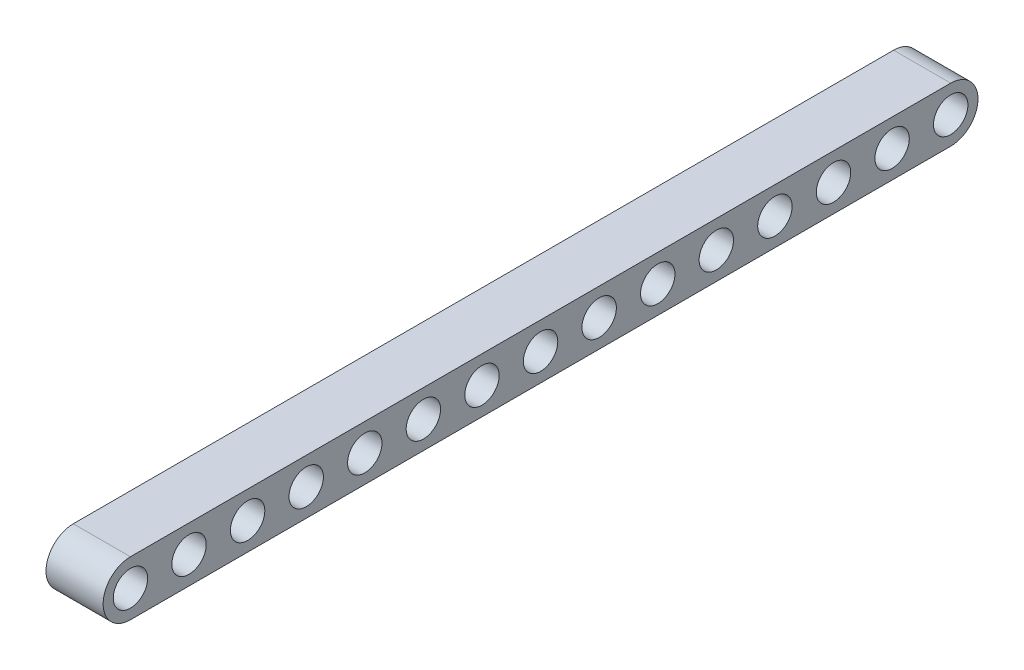
ISO-10303-21;
HEADER;
FILE_DESCRIPTION(('STEP AP214'),'2;1');
FILE_NAME('part.step','',(''),(''),'','','');
FILE_SCHEMA(('AUTOMOTIVE_DESIGN { 1 0 10303 214 1 1 1 1 }'));
ENDSEC;
DATA;
#1=APPLICATION_CONTEXT('core data for automotive mechanical design processes');
#2=APPLICATION_PROTOCOL_DEFINITION('international standard','automotive_design',2000,#1);
#3=PRODUCT_CONTEXT('',#1,'mechanical');
#4=PRODUCT('Part','Part','',(#3));
#5=PRODUCT_RELATED_PRODUCT_CATEGORY('part','',(#4));
#6=PRODUCT_DEFINITION_FORMATION('','',#4);
#7=PRODUCT_DEFINITION_CONTEXT('part definition',#1,'design');
#8=PRODUCT_DEFINITION('design','',#6,#7);
#9=PRODUCT_DEFINITION_SHAPE('','',#8);
#10=(LENGTH_UNIT() NAMED_UNIT(*) SI_UNIT(.MILLI.,.METRE.));
#11=(NAMED_UNIT(*) PLANE_ANGLE_UNIT() SI_UNIT($,.RADIAN.));
#12=(NAMED_UNIT(*) SI_UNIT($,.STERADIAN.) SOLID_ANGLE_UNIT());
#13=UNCERTAINTY_MEASURE_WITH_UNIT(LENGTH_MEASURE(1.E-05),#10,'distance_accuracy_value','');
#14=(GEOMETRIC_REPRESENTATION_CONTEXT(3) GLOBAL_UNCERTAINTY_ASSIGNED_CONTEXT((#13)) GLOBAL_UNIT_ASSIGNED_CONTEXT((#10,
#11,#12)) REPRESENTATION_CONTEXT('',''));
#15=CARTESIAN_POINT('',(0.,0.,0.));
#16=DIRECTION('',(0.,0.,1.));
#17=DIRECTION('',(1.,0.,0.));
#18=AXIS2_PLACEMENT_3D('',#15,#16,#17);
#19=CARTESIAN_POINT('',(7.8,0.,-56.));
#20=DIRECTION('',(1.,0.,0.));
#21=DIRECTION('',(0.,0.,-1.));
#22=AXIS2_PLACEMENT_3D('',#19,#20,#21);
#23=PLANE('',#22);
#24=CARTESIAN_POINT('',(7.8,0.,-48.));
#25=DIRECTION('',(1.,0.,0.));
#26=DIRECTION('',(0.,0.,-1.));
#27=AXIS2_PLACEMENT_3D('',#24,#25,#26);
#28=CIRCLE('',#27,2.35);
#29=CARTESIAN_POINT('',(7.8,0.,-50.35));
#30=VERTEX_POINT('',#29);
#31=EDGE_CURVE('E186',#30,#30,#28,.T.);
#32=ORIENTED_EDGE('',*,*,#31,.F.);
#33=EDGE_LOOP('',(#32));
#34=FACE_BOUND('',#33,.T.);
#35=CARTESIAN_POINT('',(7.8,0.,-32.));
#36=DIRECTION('',(1.,0.,0.));
#37=DIRECTION('',(0.,0.,-1.));
#38=AXIS2_PLACEMENT_3D('',#35,#36,#37);
#39=CIRCLE('',#38,2.35);
#40=CARTESIAN_POINT('',(7.8,0.,-34.35));
#41=VERTEX_POINT('',#40);
#42=EDGE_CURVE('E174',#41,#41,#39,.T.);
#43=ORIENTED_EDGE('',*,*,#42,.F.);
#44=EDGE_LOOP('',(#43));
#45=FACE_BOUND('',#44,.T.);
#46=CARTESIAN_POINT('',(7.8,0.,-16.));
#47=DIRECTION('',(1.,0.,0.));
#48=DIRECTION('',(0.,0.,-1.));
#49=AXIS2_PLACEMENT_3D('',#46,#47,#48);
#50=CIRCLE('',#49,2.35);
#51=CARTESIAN_POINT('',(7.8,0.,-18.35));
#52=VERTEX_POINT('',#51);
#53=EDGE_CURVE('E162',#52,#52,#50,.T.);
#54=ORIENTED_EDGE('',*,*,#53,.F.);
#55=EDGE_LOOP('',(#54));
#56=FACE_BOUND('',#55,.T.);
#57=CARTESIAN_POINT('',(7.8,0.,0.));
#58=DIRECTION('',(1.,0.,0.));
#59=DIRECTION('',(0.,0.,-1.));
#60=AXIS2_PLACEMENT_3D('',#57,#58,#59);
#61=CIRCLE('',#60,2.35);
#62=CARTESIAN_POINT('',(7.8,0.,-2.34999999999999));
#63=VERTEX_POINT('',#62);
#64=EDGE_CURVE('E150',#63,#63,#61,.T.);
#65=ORIENTED_EDGE('',*,*,#64,.F.);
#66=EDGE_LOOP('',(#65));
#67=FACE_BOUND('',#66,.T.);
#68=CARTESIAN_POINT('',(7.8,0.,16.));
#69=DIRECTION('',(1.,0.,0.));
#70=DIRECTION('',(0.,0.,-1.));
#71=AXIS2_PLACEMENT_3D('',#68,#69,#70);
#72=CIRCLE('',#71,2.35);
#73=CARTESIAN_POINT('',(7.8,0.,13.65));
#74=VERTEX_POINT('',#73);
#75=EDGE_CURVE('E138',#74,#74,#72,.T.);
#76=ORIENTED_EDGE('',*,*,#75,.F.);
#77=EDGE_LOOP('',(#76));
#78=FACE_BOUND('',#77,.T.);
#79=CARTESIAN_POINT('',(7.8,0.,32.));
#80=DIRECTION('',(1.,0.,0.));
#81=DIRECTION('',(0.,0.,-1.));
#82=AXIS2_PLACEMENT_3D('',#79,#80,#81);
#83=CIRCLE('',#82,2.35);
#84=CARTESIAN_POINT('',(7.8,0.,29.65));
#85=VERTEX_POINT('',#84);
#86=EDGE_CURVE('E126',#85,#85,#83,.T.);
#87=ORIENTED_EDGE('',*,*,#86,.F.);
#88=EDGE_LOOP('',(#87));
#89=FACE_BOUND('',#88,.T.);
#90=CARTESIAN_POINT('',(7.8,0.,48.));
#91=DIRECTION('',(1.,0.,0.));
#92=DIRECTION('',(0.,0.,-1.));
#93=AXIS2_PLACEMENT_3D('',#90,#91,#92);
#94=CIRCLE('',#93,2.35);
#95=CARTESIAN_POINT('',(7.8,0.,45.65));
#96=VERTEX_POINT('',#95);
#97=EDGE_CURVE('E114',#96,#96,#94,.T.);
#98=ORIENTED_EDGE('',*,*,#97,.F.);
#99=EDGE_LOOP('',(#98));
#100=FACE_BOUND('',#99,.T.);
#101=CARTESIAN_POINT('',(7.8,0.,-56.));
#102=DIRECTION('',(1.,0.,0.));
#103=DIRECTION('',(0.,0.,-1.));
#104=AXIS2_PLACEMENT_3D('',#101,#102,#103);
#105=CIRCLE('',#104,3.73000000000003);
#106=CARTESIAN_POINT('',(7.8,-3.73000000000003,-56.));
#107=VERTEX_POINT('',#106);
#108=CARTESIAN_POINT('',(7.8,3.73000000000003,-56.));
#109=VERTEX_POINT('',#108);
#110=EDGE_CURVE('E84',#107,#109,#105,.T.);
#111=ORIENTED_EDGE('',*,*,#110,.T.);
#112=DIRECTION('',(0.,0.,1.));
#113=VECTOR('',#112,1.);
#114=CARTESIAN_POINT('',(7.8,3.73000000000003,56.));
#115=LINE('',#114,#113);
#116=CARTESIAN_POINT('',(7.8,3.73,56.));
#117=VERTEX_POINT('',#116);
#118=EDGE_CURVE('E79',#109,#117,#115,.T.);
#119=ORIENTED_EDGE('',*,*,#118,.T.);
#120=CARTESIAN_POINT('',(7.8,0.,56.));
#121=DIRECTION('',(1.,0.,0.));
#122=DIRECTION('',(0.,0.,-1.));
#123=AXIS2_PLACEMENT_3D('',#120,#121,#122);
#124=CIRCLE('',#123,3.73);
#125=CARTESIAN_POINT('',(7.8,-3.72999999999997,56.));
#126=VERTEX_POINT('',#125);
#127=EDGE_CURVE('E82',#117,#126,#124,.T.);
#128=ORIENTED_EDGE('',*,*,#127,.T.);
#129=DIRECTION('',(0.,0.,-1.));
#130=VECTOR('',#129,1.);
#131=CARTESIAN_POINT('',(7.8,-3.72999999999997,56.));
#132=LINE('',#131,#130);
#133=EDGE_CURVE('E49',#126,#107,#132,.T.);
#134=ORIENTED_EDGE('',*,*,#133,.T.);
#135=EDGE_LOOP('',(#111,#119,#128,#134));
#136=FACE_BOUND('',#135,.T.);
#137=CARTESIAN_POINT('',(7.8,0.,56.));
#138=DIRECTION('',(1.,0.,0.));
#139=DIRECTION('',(0.,0.,-1.));
#140=AXIS2_PLACEMENT_3D('',#137,#138,#139);
#141=CIRCLE('',#140,2.35);
#142=CARTESIAN_POINT('',(7.8,0.,53.65));
#143=VERTEX_POINT('',#142);
#144=EDGE_CURVE('E99',#143,#143,#141,.T.);
#145=ORIENTED_EDGE('',*,*,#144,.F.);
#146=EDGE_LOOP('',(#145));
#147=FACE_BOUND('',#146,.T.);
#148=CARTESIAN_POINT('',(7.8,0.,40.));
#149=DIRECTION('',(1.,0.,0.));
#150=DIRECTION('',(0.,0.,-1.));
#151=AXIS2_PLACEMENT_3D('',#148,#149,#150);
#152=CIRCLE('',#151,2.35);
#153=CARTESIAN_POINT('',(7.8,0.,37.65));
#154=VERTEX_POINT('',#153);
#155=EDGE_CURVE('E120',#154,#154,#152,.T.);
#156=ORIENTED_EDGE('',*,*,#155,.F.);
#157=EDGE_LOOP('',(#156));
#158=FACE_BOUND('',#157,.T.);
#159=CARTESIAN_POINT('',(7.8,0.,24.));
#160=DIRECTION('',(1.,0.,0.));
#161=DIRECTION('',(0.,0.,-1.));
#162=AXIS2_PLACEMENT_3D('',#159,#160,#161);
#163=CIRCLE('',#162,2.35);
#164=CARTESIAN_POINT('',(7.8,0.,21.65));
#165=VERTEX_POINT('',#164);
#166=EDGE_CURVE('E132',#165,#165,#163,.T.);
#167=ORIENTED_EDGE('',*,*,#166,.F.);
#168=EDGE_LOOP('',(#167));
#169=FACE_BOUND('',#168,.T.);
#170=CARTESIAN_POINT('',(7.8,0.,8.00000000000001));
#171=DIRECTION('',(1.,0.,0.));
#172=DIRECTION('',(0.,0.,-1.));
#173=AXIS2_PLACEMENT_3D('',#170,#171,#172);
#174=CIRCLE('',#173,2.35);
#175=CARTESIAN_POINT('',(7.8,0.,5.65000000000001));
#176=VERTEX_POINT('',#175);
#177=EDGE_CURVE('E144',#176,#176,#174,.T.);
#178=ORIENTED_EDGE('',*,*,#177,.F.);
#179=EDGE_LOOP('',(#178));
#180=FACE_BOUND('',#179,.T.);
#181=CARTESIAN_POINT('',(7.8,0.,-7.99999999999999));
#182=DIRECTION('',(1.,0.,0.));
#183=DIRECTION('',(0.,0.,-1.));
#184=AXIS2_PLACEMENT_3D('',#181,#182,#183);
#185=CIRCLE('',#184,2.35);
#186=CARTESIAN_POINT('',(7.8,0.,-10.35));
#187=VERTEX_POINT('',#186);
#188=EDGE_CURVE('E156',#187,#187,#185,.T.);
#189=ORIENTED_EDGE('',*,*,#188,.F.);
#190=EDGE_LOOP('',(#189));
#191=FACE_BOUND('',#190,.T.);
#192=CARTESIAN_POINT('',(7.8,0.,-24.));
#193=DIRECTION('',(1.,0.,0.));
#194=DIRECTION('',(0.,0.,-1.));
#195=AXIS2_PLACEMENT_3D('',#192,#193,#194);
#196=CIRCLE('',#195,2.35);
#197=CARTESIAN_POINT('',(7.8,0.,-26.35));
#198=VERTEX_POINT('',#197);
#199=EDGE_CURVE('E168',#198,#198,#196,.T.);
#200=ORIENTED_EDGE('',*,*,#199,.F.);
#201=EDGE_LOOP('',(#200));
#202=FACE_BOUND('',#201,.T.);
#203=CARTESIAN_POINT('',(7.8,0.,-40.));
#204=DIRECTION('',(1.,0.,0.));
#205=DIRECTION('',(0.,0.,-1.));
#206=AXIS2_PLACEMENT_3D('',#203,#204,#205);
#207=CIRCLE('',#206,2.35);
#208=CARTESIAN_POINT('',(7.8,0.,-42.35));
#209=VERTEX_POINT('',#208);
#210=EDGE_CURVE('E180',#209,#209,#207,.T.);
#211=ORIENTED_EDGE('',*,*,#210,.F.);
#212=EDGE_LOOP('',(#211));
#213=FACE_BOUND('',#212,.T.);
#214=CARTESIAN_POINT('',(7.8,0.,-56.));
#215=DIRECTION('',(1.,0.,0.));
#216=DIRECTION('',(0.,0.,-1.));
#217=AXIS2_PLACEMENT_3D('',#214,#215,#216);
#218=CIRCLE('',#217,2.35);
#219=CARTESIAN_POINT('',(7.8,0.,-58.35));
#220=VERTEX_POINT('',#219);
#221=EDGE_CURVE('E192',#220,#220,#218,.T.);
#222=ORIENTED_EDGE('',*,*,#221,.F.);
#223=EDGE_LOOP('',(#222));
#224=FACE_BOUND('',#223,.T.);
#225=ADVANCED_FACE('F32',(#34,#45,#56,#67,#78,#89,#100,#136,#147,#158,#169,#180,#191,#202,#213,
#224),#23,.T.);
#226=CARTESIAN_POINT('',(0.,0.,-56.));
#227=DIRECTION('',(1.,0.,0.));
#228=DIRECTION('',(0.,0.,-1.));
#229=AXIS2_PLACEMENT_3D('',#226,#227,#228);
#230=PLANE('',#229);
#231=CARTESIAN_POINT('',(0.,0.,-56.));
#232=DIRECTION('',(1.,0.,0.));
#233=DIRECTION('',(0.,0.,-1.));
#234=AXIS2_PLACEMENT_3D('',#231,#232,#233);
#235=CIRCLE('',#234,3.73000000000003);
#236=CARTESIAN_POINT('',(0.,-3.73000000000003,-56.));
#237=VERTEX_POINT('',#236);
#238=CARTESIAN_POINT('',(0.,3.73000000000003,-56.));
#239=VERTEX_POINT('',#238);
#240=EDGE_CURVE('E96',#237,#239,#235,.T.);
#241=ORIENTED_EDGE('',*,*,#240,.F.);
#242=DIRECTION('',(0.,0.,-1.));
#243=VECTOR('',#242,1.);
#244=CARTESIAN_POINT('',(0.,-3.72999999999997,56.));
#245=LINE('',#244,#243);
#246=CARTESIAN_POINT('',(0.,-3.72999999999997,56.));
#247=VERTEX_POINT('',#246);
#248=EDGE_CURVE('E72',#247,#237,#245,.T.);
#249=ORIENTED_EDGE('',*,*,#248,.F.);
#250=CARTESIAN_POINT('',(0.,0.,56.));
#251=DIRECTION('',(1.,0.,0.));
#252=DIRECTION('',(0.,0.,-1.));
#253=AXIS2_PLACEMENT_3D('',#250,#251,#252);
#254=CIRCLE('',#253,3.73);
#255=CARTESIAN_POINT('',(0.,3.73,56.));
#256=VERTEX_POINT('',#255);
#257=EDGE_CURVE('E66',#256,#247,#254,.T.);
#258=ORIENTED_EDGE('',*,*,#257,.F.);
#259=DIRECTION('',(0.,0.,1.));
#260=VECTOR('',#259,1.);
#261=CARTESIAN_POINT('',(0.,3.73000000000003,56.));
#262=LINE('',#261,#260);
#263=EDGE_CURVE('E88',#239,#256,#262,.T.);
#264=ORIENTED_EDGE('',*,*,#263,.F.);
#265=EDGE_LOOP('',(#241,#249,#258,#264));
#266=FACE_BOUND('',#265,.T.);
#267=CARTESIAN_POINT('',(0.,0.,56.));
#268=DIRECTION('',(1.,0.,0.));
#269=DIRECTION('',(0.,0.,-1.));
#270=AXIS2_PLACEMENT_3D('',#267,#268,#269);
#271=CIRCLE('',#270,2.35);
#272=CARTESIAN_POINT('',(0.,0.,53.65));
#273=VERTEX_POINT('',#272);
#274=EDGE_CURVE('E111',#273,#273,#271,.T.);
#275=ORIENTED_EDGE('',*,*,#274,.T.);
#276=EDGE_LOOP('',(#275));
#277=FACE_BOUND('',#276,.T.);
#278=CARTESIAN_POINT('',(0.,0.,48.));
#279=DIRECTION('',(1.,0.,0.));
#280=DIRECTION('',(0.,0.,-1.));
#281=AXIS2_PLACEMENT_3D('',#278,#279,#280);
#282=CIRCLE('',#281,2.35);
#283=CARTESIAN_POINT('',(0.,0.,45.65));
#284=VERTEX_POINT('',#283);
#285=EDGE_CURVE('E117',#284,#284,#282,.T.);
#286=ORIENTED_EDGE('',*,*,#285,.T.);
#287=EDGE_LOOP('',(#286));
#288=FACE_BOUND('',#287,.T.);
#289=CARTESIAN_POINT('',(0.,0.,40.));
#290=DIRECTION('',(1.,0.,0.));
#291=DIRECTION('',(0.,0.,-1.));
#292=AXIS2_PLACEMENT_3D('',#289,#290,#291);
#293=CIRCLE('',#292,2.35);
#294=CARTESIAN_POINT('',(0.,0.,37.65));
#295=VERTEX_POINT('',#294);
#296=EDGE_CURVE('E123',#295,#295,#293,.T.);
#297=ORIENTED_EDGE('',*,*,#296,.T.);
#298=EDGE_LOOP('',(#297));
#299=FACE_BOUND('',#298,.T.);
#300=CARTESIAN_POINT('',(0.,0.,32.));
#301=DIRECTION('',(1.,0.,0.));
#302=DIRECTION('',(0.,0.,-1.));
#303=AXIS2_PLACEMENT_3D('',#300,#301,#302);
#304=CIRCLE('',#303,2.35);
#305=CARTESIAN_POINT('',(0.,0.,29.65));
#306=VERTEX_POINT('',#305);
#307=EDGE_CURVE('E129',#306,#306,#304,.T.);
#308=ORIENTED_EDGE('',*,*,#307,.T.);
#309=EDGE_LOOP('',(#308));
#310=FACE_BOUND('',#309,.T.);
#311=CARTESIAN_POINT('',(0.,0.,24.));
#312=DIRECTION('',(1.,0.,0.));
#313=DIRECTION('',(0.,0.,-1.));
#314=AXIS2_PLACEMENT_3D('',#311,#312,#313);
#315=CIRCLE('',#314,2.35);
#316=CARTESIAN_POINT('',(0.,0.,21.65));
#317=VERTEX_POINT('',#316);
#318=EDGE_CURVE('E135',#317,#317,#315,.T.);
#319=ORIENTED_EDGE('',*,*,#318,.T.);
#320=EDGE_LOOP('',(#319));
#321=FACE_BOUND('',#320,.T.);
#322=CARTESIAN_POINT('',(0.,0.,16.));
#323=DIRECTION('',(1.,0.,0.));
#324=DIRECTION('',(0.,0.,-1.));
#325=AXIS2_PLACEMENT_3D('',#322,#323,#324);
#326=CIRCLE('',#325,2.35);
#327=CARTESIAN_POINT('',(0.,0.,13.65));
#328=VERTEX_POINT('',#327);
#329=EDGE_CURVE('E141',#328,#328,#326,.T.);
#330=ORIENTED_EDGE('',*,*,#329,.T.);
#331=EDGE_LOOP('',(#330));
#332=FACE_BOUND('',#331,.T.);
#333=CARTESIAN_POINT('',(0.,0.,8.00000000000001));
#334=DIRECTION('',(1.,0.,0.));
#335=DIRECTION('',(0.,0.,-1.));
#336=AXIS2_PLACEMENT_3D('',#333,#334,#335);
#337=CIRCLE('',#336,2.35);
#338=CARTESIAN_POINT('',(0.,0.,5.65000000000001));
#339=VERTEX_POINT('',#338);
#340=EDGE_CURVE('E147',#339,#339,#337,.T.);
#341=ORIENTED_EDGE('',*,*,#340,.T.);
#342=EDGE_LOOP('',(#341));
#343=FACE_BOUND('',#342,.T.);
#344=CARTESIAN_POINT('',(0.,0.,0.));
#345=DIRECTION('',(1.,0.,0.));
#346=DIRECTION('',(0.,0.,-1.));
#347=AXIS2_PLACEMENT_3D('',#344,#345,#346);
#348=CIRCLE('',#347,2.35);
#349=CARTESIAN_POINT('',(0.,0.,-2.34999999999999));
#350=VERTEX_POINT('',#349);
#351=EDGE_CURVE('E153',#350,#350,#348,.T.);
#352=ORIENTED_EDGE('',*,*,#351,.T.);
#353=EDGE_LOOP('',(#352));
#354=FACE_BOUND('',#353,.T.);
#355=CARTESIAN_POINT('',(0.,0.,-7.99999999999999));
#356=DIRECTION('',(1.,0.,0.));
#357=DIRECTION('',(0.,0.,-1.));
#358=AXIS2_PLACEMENT_3D('',#355,#356,#357);
#359=CIRCLE('',#358,2.35);
#360=CARTESIAN_POINT('',(0.,0.,-10.35));
#361=VERTEX_POINT('',#360);
#362=EDGE_CURVE('E159',#361,#361,#359,.T.);
#363=ORIENTED_EDGE('',*,*,#362,.T.);
#364=EDGE_LOOP('',(#363));
#365=FACE_BOUND('',#364,.T.);
#366=CARTESIAN_POINT('',(0.,0.,-16.));
#367=DIRECTION('',(1.,0.,0.));
#368=DIRECTION('',(0.,0.,-1.));
#369=AXIS2_PLACEMENT_3D('',#366,#367,#368);
#370=CIRCLE('',#369,2.35);
#371=CARTESIAN_POINT('',(0.,0.,-18.35));
#372=VERTEX_POINT('',#371);
#373=EDGE_CURVE('E165',#372,#372,#370,.T.);
#374=ORIENTED_EDGE('',*,*,#373,.T.);
#375=EDGE_LOOP('',(#374));
#376=FACE_BOUND('',#375,.T.);
#377=CARTESIAN_POINT('',(0.,0.,-24.));
#378=DIRECTION('',(1.,0.,0.));
#379=DIRECTION('',(0.,0.,-1.));
#380=AXIS2_PLACEMENT_3D('',#377,#378,#379);
#381=CIRCLE('',#380,2.35);
#382=CARTESIAN_POINT('',(0.,0.,-26.35));
#383=VERTEX_POINT('',#382);
#384=EDGE_CURVE('E171',#383,#383,#381,.T.);
#385=ORIENTED_EDGE('',*,*,#384,.T.);
#386=EDGE_LOOP('',(#385));
#387=FACE_BOUND('',#386,.T.);
#388=CARTESIAN_POINT('',(0.,0.,-32.));
#389=DIRECTION('',(1.,0.,0.));
#390=DIRECTION('',(0.,0.,-1.));
#391=AXIS2_PLACEMENT_3D('',#388,#389,#390);
#392=CIRCLE('',#391,2.35);
#393=CARTESIAN_POINT('',(0.,0.,-34.35));
#394=VERTEX_POINT('',#393);
#395=EDGE_CURVE('E177',#394,#394,#392,.T.);
#396=ORIENTED_EDGE('',*,*,#395,.T.);
#397=EDGE_LOOP('',(#396));
#398=FACE_BOUND('',#397,.T.);
#399=CARTESIAN_POINT('',(0.,0.,-40.));
#400=DIRECTION('',(1.,0.,0.));
#401=DIRECTION('',(0.,0.,-1.));
#402=AXIS2_PLACEMENT_3D('',#399,#400,#401);
#403=CIRCLE('',#402,2.35);
#404=CARTESIAN_POINT('',(0.,0.,-42.35));
#405=VERTEX_POINT('',#404);
#406=EDGE_CURVE('E183',#405,#405,#403,.T.);
#407=ORIENTED_EDGE('',*,*,#406,.T.);
#408=EDGE_LOOP('',(#407));
#409=FACE_BOUND('',#408,.T.);
#410=CARTESIAN_POINT('',(0.,0.,-48.));
#411=DIRECTION('',(1.,0.,0.));
#412=DIRECTION('',(0.,0.,-1.));
#413=AXIS2_PLACEMENT_3D('',#410,#411,#412);
#414=CIRCLE('',#413,2.35);
#415=CARTESIAN_POINT('',(0.,0.,-50.35));
#416=VERTEX_POINT('',#415);
#417=EDGE_CURVE('E189',#416,#416,#414,.T.);
#418=ORIENTED_EDGE('',*,*,#417,.T.);
#419=EDGE_LOOP('',(#418));
#420=FACE_BOUND('',#419,.T.);
#421=CARTESIAN_POINT('',(0.,0.,-56.));
#422=DIRECTION('',(1.,0.,0.));
#423=DIRECTION('',(0.,0.,-1.));
#424=AXIS2_PLACEMENT_3D('',#421,#422,#423);
#425=CIRCLE('',#424,2.35);
#426=CARTESIAN_POINT('',(0.,0.,-58.35));
#427=VERTEX_POINT('',#426);
#428=EDGE_CURVE('E195',#427,#427,#425,.T.);
#429=ORIENTED_EDGE('',*,*,#428,.T.);
#430=EDGE_LOOP('',(#429));
#431=FACE_BOUND('',#430,.T.);
#432=ADVANCED_FACE('F107',(#266,#277,#288,#299,#310,#321,#332,#343,#354,#365,#376,#387,#398,
#409,#420,#431),#230,.F.);
#433=CARTESIAN_POINT('',(7.8,0.,-56.));
#434=DIRECTION('',(-1.,0.,0.));
#435=DIRECTION('',(0.,0.,1.));
#436=AXIS2_PLACEMENT_3D('',#433,#434,#435);
#437=CYLINDRICAL_SURFACE('',#436,3.73000000000003);
#438=ORIENTED_EDGE('',*,*,#240,.T.);
#439=DIRECTION('',(-1.,0.,0.));
#440=VECTOR('',#439,1.);
#441=CARTESIAN_POINT('',(7.8,3.73000000000003,-56.));
#442=LINE('',#441,#440);
#443=EDGE_CURVE('E11',#109,#239,#442,.T.);
#444=ORIENTED_EDGE('',*,*,#443,.F.);
#445=ORIENTED_EDGE('',*,*,#110,.F.);
#446=DIRECTION('',(-1.,0.,0.));
#447=VECTOR('',#446,1.);
#448=CARTESIAN_POINT('',(7.8,-3.73000000000003,-56.));
#449=LINE('',#448,#447);
#450=EDGE_CURVE('E92',#107,#237,#449,.T.);
#451=ORIENTED_EDGE('',*,*,#450,.T.);
#452=EDGE_LOOP('',(#438,#444,#445,#451));
#453=FACE_BOUND('',#452,.T.);
#454=ADVANCED_FACE('F34',(#453),#437,.T.);
#455=CARTESIAN_POINT('',(7.8,3.73000000000003,56.));
#456=DIRECTION('',(0.,-1.,0.));
#457=DIRECTION('',(0.,0.,-1.));
#458=AXIS2_PLACEMENT_3D('',#455,#456,#457);
#459=PLANE('',#458);
#460=ORIENTED_EDGE('',*,*,#263,.T.);
#461=DIRECTION('',(-1.,0.,0.));
#462=VECTOR('',#461,1.);
#463=CARTESIAN_POINT('',(7.8,3.73,56.));
#464=LINE('',#463,#462);
#465=EDGE_CURVE('E41',#117,#256,#464,.T.);
#466=ORIENTED_EDGE('',*,*,#465,.F.);
#467=ORIENTED_EDGE('',*,*,#118,.F.);
#468=ORIENTED_EDGE('',*,*,#443,.T.);
#469=EDGE_LOOP('',(#460,#466,#467,#468));
#470=FACE_BOUND('',#469,.T.);
#471=ADVANCED_FACE('F87',(#470),#459,.F.);
#472=CARTESIAN_POINT('',(7.8,0.,56.));
#473=DIRECTION('',(-1.,0.,0.));
#474=DIRECTION('',(0.,0.,1.));
#475=AXIS2_PLACEMENT_3D('',#472,#473,#474);
#476=CYLINDRICAL_SURFACE('',#475,3.73);
#477=ORIENTED_EDGE('',*,*,#257,.T.);
#478=DIRECTION('',(-1.,0.,0.));
#479=VECTOR('',#478,1.);
#480=CARTESIAN_POINT('',(7.8,-3.72999999999997,56.));
#481=LINE('',#480,#479);
#482=EDGE_CURVE('E89',#126,#247,#481,.T.);
#483=ORIENTED_EDGE('',*,*,#482,.F.);
#484=ORIENTED_EDGE('',*,*,#127,.F.);
#485=ORIENTED_EDGE('',*,*,#465,.T.);
#486=EDGE_LOOP('',(#477,#483,#484,#485));
#487=FACE_BOUND('',#486,.T.);
#488=ADVANCED_FACE('F90',(#487),#476,.T.);
#489=CARTESIAN_POINT('',(7.8,-3.72999999999997,56.));
#490=DIRECTION('',(0.,1.,0.));
#491=DIRECTION('',(0.,0.,1.));
#492=AXIS2_PLACEMENT_3D('',#489,#490,#491);
#493=PLANE('',#492);
#494=ORIENTED_EDGE('',*,*,#248,.T.);
#495=ORIENTED_EDGE('',*,*,#450,.F.);
#496=ORIENTED_EDGE('',*,*,#133,.F.);
#497=ORIENTED_EDGE('',*,*,#482,.T.);
#498=EDGE_LOOP('',(#494,#495,#496,#497));
#499=FACE_BOUND('',#498,.T.);
#500=ADVANCED_FACE('F104',(#499),#493,.F.);
#501=CARTESIAN_POINT('',(7.8,0.,56.));
#502=DIRECTION('',(-1.,0.,0.));
#503=DIRECTION('',(0.,0.,1.));
#504=AXIS2_PLACEMENT_3D('',#501,#502,#503);
#505=CYLINDRICAL_SURFACE('',#504,2.35);
#506=ORIENTED_EDGE('',*,*,#144,.T.);
#507=EDGE_LOOP('',(#506));
#508=FACE_BOUND('',#507,.T.);
#509=ORIENTED_EDGE('',*,*,#274,.F.);
#510=EDGE_LOOP('',(#509));
#511=FACE_BOUND('',#510,.T.);
#512=ADVANCED_FACE('F214',(#508,#511),#505,.F.);
#513=CARTESIAN_POINT('',(7.8,0.,48.));
#514=DIRECTION('',(-1.,0.,0.));
#515=DIRECTION('',(0.,0.,1.));
#516=AXIS2_PLACEMENT_3D('',#513,#514,#515);
#517=CYLINDRICAL_SURFACE('',#516,2.35);
#518=ORIENTED_EDGE('',*,*,#97,.T.);
#519=EDGE_LOOP('',(#518));
#520=FACE_BOUND('',#519,.T.);
#521=ORIENTED_EDGE('',*,*,#285,.F.);
#522=EDGE_LOOP('',(#521));
#523=FACE_BOUND('',#522,.T.);
#524=ADVANCED_FACE('F260',(#520,#523),#517,.F.);
#525=CARTESIAN_POINT('',(7.8,0.,40.));
#526=DIRECTION('',(-1.,0.,0.));
#527=DIRECTION('',(0.,0.,1.));
#528=AXIS2_PLACEMENT_3D('',#525,#526,#527);
#529=CYLINDRICAL_SURFACE('',#528,2.35);
#530=ORIENTED_EDGE('',*,*,#155,.T.);
#531=EDGE_LOOP('',(#530));
#532=FACE_BOUND('',#531,.T.);
#533=ORIENTED_EDGE('',*,*,#296,.F.);
#534=EDGE_LOOP('',(#533));
#535=FACE_BOUND('',#534,.T.);
#536=ADVANCED_FACE('F268',(#532,#535),#529,.F.);
#537=CARTESIAN_POINT('',(7.8,0.,32.));
#538=DIRECTION('',(-1.,0.,0.));
#539=DIRECTION('',(0.,0.,1.));
#540=AXIS2_PLACEMENT_3D('',#537,#538,#539);
#541=CYLINDRICAL_SURFACE('',#540,2.35);
#542=ORIENTED_EDGE('',*,*,#86,.T.);
#543=EDGE_LOOP('',(#542));
#544=FACE_BOUND('',#543,.T.);
#545=ORIENTED_EDGE('',*,*,#307,.F.);
#546=EDGE_LOOP('',(#545));
#547=FACE_BOUND('',#546,.T.);
#548=ADVANCED_FACE('F276',(#544,#547),#541,.F.);
#549=CARTESIAN_POINT('',(7.8,0.,24.));
#550=DIRECTION('',(-1.,0.,0.));
#551=DIRECTION('',(0.,0.,1.));
#552=AXIS2_PLACEMENT_3D('',#549,#550,#551);
#553=CYLINDRICAL_SURFACE('',#552,2.35);
#554=ORIENTED_EDGE('',*,*,#166,.T.);
#555=EDGE_LOOP('',(#554));
#556=FACE_BOUND('',#555,.T.);
#557=ORIENTED_EDGE('',*,*,#318,.F.);
#558=EDGE_LOOP('',(#557));
#559=FACE_BOUND('',#558,.T.);
#560=ADVANCED_FACE('F285',(#556,#559),#553,.F.);
#561=CARTESIAN_POINT('',(7.8,0.,16.));
#562=DIRECTION('',(-1.,0.,0.));
#563=DIRECTION('',(0.,0.,1.));
#564=AXIS2_PLACEMENT_3D('',#561,#562,#563);
#565=CYLINDRICAL_SURFACE('',#564,2.35);
#566=ORIENTED_EDGE('',*,*,#75,.T.);
#567=EDGE_LOOP('',(#566));
#568=FACE_BOUND('',#567,.T.);
#569=ORIENTED_EDGE('',*,*,#329,.F.);
#570=EDGE_LOOP('',(#569));
#571=FACE_BOUND('',#570,.T.);
#572=ADVANCED_FACE('F294',(#568,#571),#565,.F.);
#573=CARTESIAN_POINT('',(7.8,0.,8.00000000000001));
#574=DIRECTION('',(-1.,0.,0.));
#575=DIRECTION('',(0.,0.,1.));
#576=AXIS2_PLACEMENT_3D('',#573,#574,#575);
#577=CYLINDRICAL_SURFACE('',#576,2.35);
#578=ORIENTED_EDGE('',*,*,#177,.T.);
#579=EDGE_LOOP('',(#578));
#580=FACE_BOUND('',#579,.T.);
#581=ORIENTED_EDGE('',*,*,#340,.F.);
#582=EDGE_LOOP('',(#581));
#583=FACE_BOUND('',#582,.T.);
#584=ADVANCED_FACE('F303',(#580,#583),#577,.F.);
#585=CARTESIAN_POINT('',(7.8,0.,0.));
#586=DIRECTION('',(-1.,0.,0.));
#587=DIRECTION('',(0.,0.,1.));
#588=AXIS2_PLACEMENT_3D('',#585,#586,#587);
#589=CYLINDRICAL_SURFACE('',#588,2.35);
#590=ORIENTED_EDGE('',*,*,#64,.T.);
#591=EDGE_LOOP('',(#590));
#592=FACE_BOUND('',#591,.T.);
#593=ORIENTED_EDGE('',*,*,#351,.F.);
#594=EDGE_LOOP('',(#593));
#595=FACE_BOUND('',#594,.T.);
#596=ADVANCED_FACE('F312',(#592,#595),#589,.F.);
#597=CARTESIAN_POINT('',(7.8,0.,-7.99999999999999));
#598=DIRECTION('',(-1.,0.,0.));
#599=DIRECTION('',(0.,0.,1.));
#600=AXIS2_PLACEMENT_3D('',#597,#598,#599);
#601=CYLINDRICAL_SURFACE('',#600,2.35);
#602=ORIENTED_EDGE('',*,*,#188,.T.);
#603=EDGE_LOOP('',(#602));
#604=FACE_BOUND('',#603,.T.);
#605=ORIENTED_EDGE('',*,*,#362,.F.);
#606=EDGE_LOOP('',(#605));
#607=FACE_BOUND('',#606,.T.);
#608=ADVANCED_FACE('F321',(#604,#607),#601,.F.);
#609=CARTESIAN_POINT('',(7.8,0.,-16.));
#610=DIRECTION('',(-1.,0.,0.));
#611=DIRECTION('',(0.,0.,1.));
#612=AXIS2_PLACEMENT_3D('',#609,#610,#611);
#613=CYLINDRICAL_SURFACE('',#612,2.35);
#614=ORIENTED_EDGE('',*,*,#53,.T.);
#615=EDGE_LOOP('',(#614));
#616=FACE_BOUND('',#615,.T.);
#617=ORIENTED_EDGE('',*,*,#373,.F.);
#618=EDGE_LOOP('',(#617));
#619=FACE_BOUND('',#618,.T.);
#620=ADVANCED_FACE('F330',(#616,#619),#613,.F.);
#621=CARTESIAN_POINT('',(7.8,0.,-24.));
#622=DIRECTION('',(-1.,0.,0.));
#623=DIRECTION('',(0.,0.,1.));
#624=AXIS2_PLACEMENT_3D('',#621,#622,#623);
#625=CYLINDRICAL_SURFACE('',#624,2.35);
#626=ORIENTED_EDGE('',*,*,#199,.T.);
#627=EDGE_LOOP('',(#626));
#628=FACE_BOUND('',#627,.T.);
#629=ORIENTED_EDGE('',*,*,#384,.F.);
#630=EDGE_LOOP('',(#629));
#631=FACE_BOUND('',#630,.T.);
#632=ADVANCED_FACE('F339',(#628,#631),#625,.F.);
#633=CARTESIAN_POINT('',(7.8,0.,-32.));
#634=DIRECTION('',(-1.,0.,0.));
#635=DIRECTION('',(0.,0.,1.));
#636=AXIS2_PLACEMENT_3D('',#633,#634,#635);
#637=CYLINDRICAL_SURFACE('',#636,2.35);
#638=ORIENTED_EDGE('',*,*,#42,.T.);
#639=EDGE_LOOP('',(#638));
#640=FACE_BOUND('',#639,.T.);
#641=ORIENTED_EDGE('',*,*,#395,.F.);
#642=EDGE_LOOP('',(#641));
#643=FACE_BOUND('',#642,.T.);
#644=ADVANCED_FACE('F348',(#640,#643),#637,.F.);
#645=CARTESIAN_POINT('',(7.8,0.,-40.));
#646=DIRECTION('',(-1.,0.,0.));
#647=DIRECTION('',(0.,0.,1.));
#648=AXIS2_PLACEMENT_3D('',#645,#646,#647);
#649=CYLINDRICAL_SURFACE('',#648,2.35);
#650=ORIENTED_EDGE('',*,*,#210,.T.);
#651=EDGE_LOOP('',(#650));
#652=FACE_BOUND('',#651,.T.);
#653=ORIENTED_EDGE('',*,*,#406,.F.);
#654=EDGE_LOOP('',(#653));
#655=FACE_BOUND('',#654,.T.);
#656=ADVANCED_FACE('F357',(#652,#655),#649,.F.);
#657=CARTESIAN_POINT('',(7.8,0.,-48.));
#658=DIRECTION('',(-1.,0.,0.));
#659=DIRECTION('',(0.,0.,1.));
#660=AXIS2_PLACEMENT_3D('',#657,#658,#659);
#661=CYLINDRICAL_SURFACE('',#660,2.35);
#662=ORIENTED_EDGE('',*,*,#31,.T.);
#663=EDGE_LOOP('',(#662));
#664=FACE_BOUND('',#663,.T.);
#665=ORIENTED_EDGE('',*,*,#417,.F.);
#666=EDGE_LOOP('',(#665));
#667=FACE_BOUND('',#666,.T.);
#668=ADVANCED_FACE('F366',(#664,#667),#661,.F.);
#669=CARTESIAN_POINT('',(7.8,0.,-56.));
#670=DIRECTION('',(-1.,0.,0.));
#671=DIRECTION('',(0.,0.,1.));
#672=AXIS2_PLACEMENT_3D('',#669,#670,#671);
#673=CYLINDRICAL_SURFACE('',#672,2.35);
#674=ORIENTED_EDGE('',*,*,#221,.T.);
#675=EDGE_LOOP('',(#674));
#676=FACE_BOUND('',#675,.T.);
#677=ORIENTED_EDGE('',*,*,#428,.F.);
#678=EDGE_LOOP('',(#677));
#679=FACE_BOUND('',#678,.T.);
#680=ADVANCED_FACE('F201',(#676,#679),#673,.F.);
#681=CLOSED_SHELL('',(#225,#432,#454,#471,#488,#500,#512,#524,#536,#548,#560,#572,#584,#596,
#608,#620,#632,#644,#656,#668,#680));
#682=MANIFOLD_SOLID_BREP('B2',#681);
#683=ADVANCED_BREP_SHAPE_REPRESENTATION('',(#18,#682),#14);
#684=SHAPE_DEFINITION_REPRESENTATION(#9,#683);
ENDSEC;
END-ISO-10303-21;
